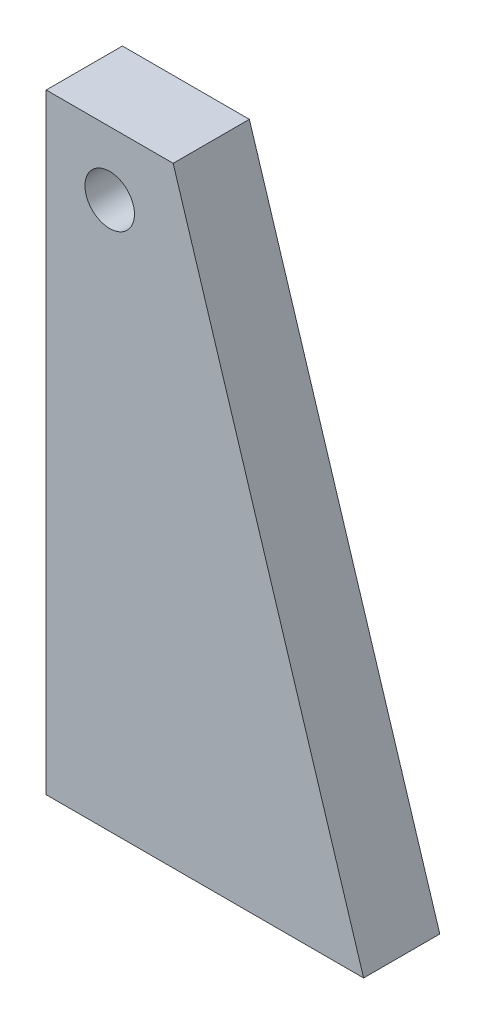
ISO-10303-21;
HEADER;
FILE_DESCRIPTION(('STEP AP214'),'2;1');
FILE_NAME('part.step','',(''),(''),'','','');
FILE_SCHEMA(('AUTOMOTIVE_DESIGN { 1 0 10303 214 1 1 1 1 }'));
ENDSEC;
DATA;
#1=APPLICATION_CONTEXT('core data for automotive mechanical design processes');
#2=APPLICATION_PROTOCOL_DEFINITION('international standard','automotive_design',2000,#1);
#3=PRODUCT_CONTEXT('',#1,'mechanical');
#4=PRODUCT('Part','Part','',(#3));
#5=PRODUCT_RELATED_PRODUCT_CATEGORY('part','',(#4));
#6=PRODUCT_DEFINITION_FORMATION('','',#4);
#7=PRODUCT_DEFINITION_CONTEXT('part definition',#1,'design');
#8=PRODUCT_DEFINITION('design','',#6,#7);
#9=PRODUCT_DEFINITION_SHAPE('','',#8);
#10=(LENGTH_UNIT() NAMED_UNIT(*) SI_UNIT(.MILLI.,.METRE.));
#11=(NAMED_UNIT(*) PLANE_ANGLE_UNIT() SI_UNIT($,.RADIAN.));
#12=(NAMED_UNIT(*) SI_UNIT($,.STERADIAN.) SOLID_ANGLE_UNIT());
#13=UNCERTAINTY_MEASURE_WITH_UNIT(LENGTH_MEASURE(1.E-05),#10,'distance_accuracy_value','');
#14=(GEOMETRIC_REPRESENTATION_CONTEXT(3) GLOBAL_UNCERTAINTY_ASSIGNED_CONTEXT((#13)) GLOBAL_UNIT_ASSIGNED_CONTEXT((#10,
#11,#12)) REPRESENTATION_CONTEXT('',''));
#15=CARTESIAN_POINT('',(0.,0.,0.));
#16=DIRECTION('',(0.,0.,1.));
#17=DIRECTION('',(1.,0.,0.));
#18=AXIS2_PLACEMENT_3D('',#15,#16,#17);
#19=CARTESIAN_POINT('',(0.,0.,6.));
#20=DIRECTION('',(0.,0.,1.));
#21=DIRECTION('',(1.,0.,0.));
#22=AXIS2_PLACEMENT_3D('',#19,#20,#21);
#23=PLANE('',#22);
#24=DIRECTION('',(1.,0.,0.));
#25=VECTOR('',#24,1.);
#26=CARTESIAN_POINT('',(0.,0.,6.));
#27=LINE('',#26,#25);
#28=CARTESIAN_POINT('',(-5.,0.,6.));
#29=VERTEX_POINT('',#28);
#30=CARTESIAN_POINT('',(20.,0.,6.));
#31=VERTEX_POINT('',#30);
#32=EDGE_CURVE('E57',#29,#31,#27,.T.);
#33=ORIENTED_EDGE('',*,*,#32,.T.);
#34=DIRECTION('',(-0.297879208642442,0.95460357062948,0.));
#35=VECTOR('',#34,1.);
#36=CARTESIAN_POINT('',(5.,48.07,6.));
#37=LINE('',#36,#35);
#38=CARTESIAN_POINT('',(5.,48.07,6.));
#39=VERTEX_POINT('',#38);
#40=EDGE_CURVE('E88',#31,#39,#37,.T.);
#41=ORIENTED_EDGE('',*,*,#40,.T.);
#42=DIRECTION('',(-1.,0.,0.));
#43=VECTOR('',#42,1.);
#44=CARTESIAN_POINT('',(-5.,48.07,6.));
#45=LINE('',#44,#43);
#46=CARTESIAN_POINT('',(-5.,48.07,6.));
#47=VERTEX_POINT('',#46);
#48=EDGE_CURVE('E92',#39,#47,#45,.T.);
#49=ORIENTED_EDGE('',*,*,#48,.T.);
#50=DIRECTION('',(0.,-1.,0.));
#51=VECTOR('',#50,1.);
#52=CARTESIAN_POINT('',(-5.,0.,6.));
#53=LINE('',#52,#51);
#54=EDGE_CURVE('E102',#47,#29,#53,.T.);
#55=ORIENTED_EDGE('',*,*,#54,.T.);
#56=EDGE_LOOP('',(#33,#41,#49,#55));
#57=FACE_BOUND('',#56,.T.);
#58=CARTESIAN_POINT('',(0.,43.07,6.));
#59=DIRECTION('',(0.,0.,1.));
#60=DIRECTION('',(1.,0.,0.));
#61=AXIS2_PLACEMENT_3D('',#58,#59,#60);
#62=CIRCLE('',#61,1.95);
#63=CARTESIAN_POINT('',(1.95,43.07,6.));
#64=VERTEX_POINT('',#63);
#65=EDGE_CURVE('E111',#64,#64,#62,.T.);
#66=ORIENTED_EDGE('',*,*,#65,.F.);
#67=EDGE_LOOP('',(#66));
#68=FACE_BOUND('',#67,.T.);
#69=ADVANCED_FACE('F39',(#57,#68),#23,.T.);
#70=CARTESIAN_POINT('',(0.,0.,0.));
#71=DIRECTION('',(0.,0.,1.));
#72=DIRECTION('',(1.,0.,0.));
#73=AXIS2_PLACEMENT_3D('',#70,#71,#72);
#74=PLANE('',#73);
#75=DIRECTION('',(-0.297879208642442,0.95460357062948,0.));
#76=VECTOR('',#75,1.);
#77=CARTESIAN_POINT('',(5.,48.07,0.));
#78=LINE('',#77,#76);
#79=CARTESIAN_POINT('',(20.,0.,0.));
#80=VERTEX_POINT('',#79);
#81=CARTESIAN_POINT('',(5.,48.07,0.));
#82=VERTEX_POINT('',#81);
#83=EDGE_CURVE('E96',#80,#82,#78,.T.);
#84=ORIENTED_EDGE('',*,*,#83,.F.);
#85=DIRECTION('',(1.,0.,0.));
#86=VECTOR('',#85,1.);
#87=CARTESIAN_POINT('',(0.,0.,0.));
#88=LINE('',#87,#86);
#89=CARTESIAN_POINT('',(-5.,0.,0.));
#90=VERTEX_POINT('',#89);
#91=EDGE_CURVE('E116',#90,#80,#88,.T.);
#92=ORIENTED_EDGE('',*,*,#91,.F.);
#93=DIRECTION('',(0.,-1.,0.));
#94=VECTOR('',#93,1.);
#95=CARTESIAN_POINT('',(-5.,0.,0.));
#96=LINE('',#95,#94);
#97=CARTESIAN_POINT('',(-5.,48.07,0.));
#98=VERTEX_POINT('',#97);
#99=EDGE_CURVE('E82',#98,#90,#96,.T.);
#100=ORIENTED_EDGE('',*,*,#99,.F.);
#101=DIRECTION('',(-1.,0.,0.));
#102=VECTOR('',#101,1.);
#103=CARTESIAN_POINT('',(-5.,48.07,0.));
#104=LINE('',#103,#102);
#105=EDGE_CURVE('E75',#82,#98,#104,.T.);
#106=ORIENTED_EDGE('',*,*,#105,.F.);
#107=EDGE_LOOP('',(#84,#92,#100,#106));
#108=FACE_BOUND('',#107,.T.);
#109=CARTESIAN_POINT('',(0.,43.07,0.));
#110=DIRECTION('',(0.,0.,1.));
#111=DIRECTION('',(1.,0.,0.));
#112=AXIS2_PLACEMENT_3D('',#109,#110,#111);
#113=CIRCLE('',#112,1.95);
#114=CARTESIAN_POINT('',(1.95,43.07,0.));
#115=VERTEX_POINT('',#114);
#116=EDGE_CURVE('E192',#115,#115,#113,.T.);
#117=ORIENTED_EDGE('',*,*,#116,.T.);
#118=EDGE_LOOP('',(#117));
#119=FACE_BOUND('',#118,.T.);
#120=ADVANCED_FACE('F125',(#108,#119),#74,.F.);
#121=CARTESIAN_POINT('',(5.,48.07,6.));
#122=DIRECTION('',(-0.95460357062948,-0.297879208642442,0.));
#123=DIRECTION('',(0.297879208642442,-0.95460357062948,0.));
#124=AXIS2_PLACEMENT_3D('',#121,#122,#123);
#125=PLANE('',#124);
#126=ORIENTED_EDGE('',*,*,#83,.T.);
#127=DIRECTION('',(0.,0.,-1.));
#128=VECTOR('',#127,1.);
#129=CARTESIAN_POINT('',(5.,48.07,6.));
#130=LINE('',#129,#128);
#131=EDGE_CURVE('E49',#39,#82,#130,.T.);
#132=ORIENTED_EDGE('',*,*,#131,.F.);
#133=ORIENTED_EDGE('',*,*,#40,.F.);
#134=DIRECTION('',(0.,0.,-1.));
#135=VECTOR('',#134,1.);
#136=CARTESIAN_POINT('',(20.,0.,6.));
#137=LINE('',#136,#135);
#138=EDGE_CURVE('E11',#31,#80,#137,.T.);
#139=ORIENTED_EDGE('',*,*,#138,.T.);
#140=EDGE_LOOP('',(#126,#132,#133,#139));
#141=FACE_BOUND('',#140,.T.);
#142=ADVANCED_FACE('F41',(#141),#125,.F.);
#143=CARTESIAN_POINT('',(-5.,48.07,6.));
#144=DIRECTION('',(0.,-1.,0.));
#145=DIRECTION('',(0.,0.,-1.));
#146=AXIS2_PLACEMENT_3D('',#143,#144,#145);
#147=PLANE('',#146);
#148=ORIENTED_EDGE('',*,*,#105,.T.);
#149=DIRECTION('',(0.,0.,-1.));
#150=VECTOR('',#149,1.);
#151=CARTESIAN_POINT('',(-5.,48.07,6.));
#152=LINE('',#151,#150);
#153=EDGE_CURVE('E98',#47,#98,#152,.T.);
#154=ORIENTED_EDGE('',*,*,#153,.F.);
#155=ORIENTED_EDGE('',*,*,#48,.F.);
#156=ORIENTED_EDGE('',*,*,#131,.T.);
#157=EDGE_LOOP('',(#148,#154,#155,#156));
#158=FACE_BOUND('',#157,.T.);
#159=ADVANCED_FACE('F99',(#158),#147,.F.);
#160=CARTESIAN_POINT('',(-5.,0.,6.));
#161=DIRECTION('',(1.,0.,0.));
#162=DIRECTION('',(0.,0.,-1.));
#163=AXIS2_PLACEMENT_3D('',#160,#161,#162);
#164=PLANE('',#163);
#165=ORIENTED_EDGE('',*,*,#99,.T.);
#166=DIRECTION('',(0.,0.,-1.));
#167=VECTOR('',#166,1.);
#168=CARTESIAN_POINT('',(-5.,0.,6.));
#169=LINE('',#168,#167);
#170=EDGE_CURVE('E105',#29,#90,#169,.T.);
#171=ORIENTED_EDGE('',*,*,#170,.F.);
#172=ORIENTED_EDGE('',*,*,#54,.F.);
#173=ORIENTED_EDGE('',*,*,#153,.T.);
#174=EDGE_LOOP('',(#165,#171,#172,#173));
#175=FACE_BOUND('',#174,.T.);
#176=ADVANCED_FACE('F122',(#175),#164,.F.);
#177=CARTESIAN_POINT('',(0.,0.,6.));
#178=DIRECTION('',(0.,1.,0.));
#179=DIRECTION('',(0.,0.,1.));
#180=AXIS2_PLACEMENT_3D('',#177,#178,#179);
#181=PLANE('',#180);
#182=ORIENTED_EDGE('',*,*,#91,.T.);
#183=ORIENTED_EDGE('',*,*,#138,.F.);
#184=ORIENTED_EDGE('',*,*,#32,.F.);
#185=ORIENTED_EDGE('',*,*,#170,.T.);
#186=EDGE_LOOP('',(#182,#183,#184,#185));
#187=FACE_BOUND('',#186,.T.);
#188=ADVANCED_FACE('F127',(#187),#181,.F.);
#189=CARTESIAN_POINT('',(0.,43.07,6.));
#190=DIRECTION('',(0.,0.,-1.));
#191=DIRECTION('',(-1.,0.,0.));
#192=AXIS2_PLACEMENT_3D('',#189,#190,#191);
#193=CYLINDRICAL_SURFACE('',#192,1.95);
#194=ORIENTED_EDGE('',*,*,#65,.T.);
#195=EDGE_LOOP('',(#194));
#196=FACE_BOUND('',#195,.T.);
#197=ORIENTED_EDGE('',*,*,#116,.F.);
#198=EDGE_LOOP('',(#197));
#199=FACE_BOUND('',#198,.T.);
#200=ADVANCED_FACE('F129',(#196,#199),#193,.F.);
#201=CLOSED_SHELL('',(#69,#120,#142,#159,#176,#188,#200));
#202=MANIFOLD_SOLID_BREP('B2',#201);
#203=ADVANCED_BREP_SHAPE_REPRESENTATION('',(#18,#202),#14);
#204=SHAPE_DEFINITION_REPRESENTATION(#9,#203);
ENDSEC;
END-ISO-10303-21;
